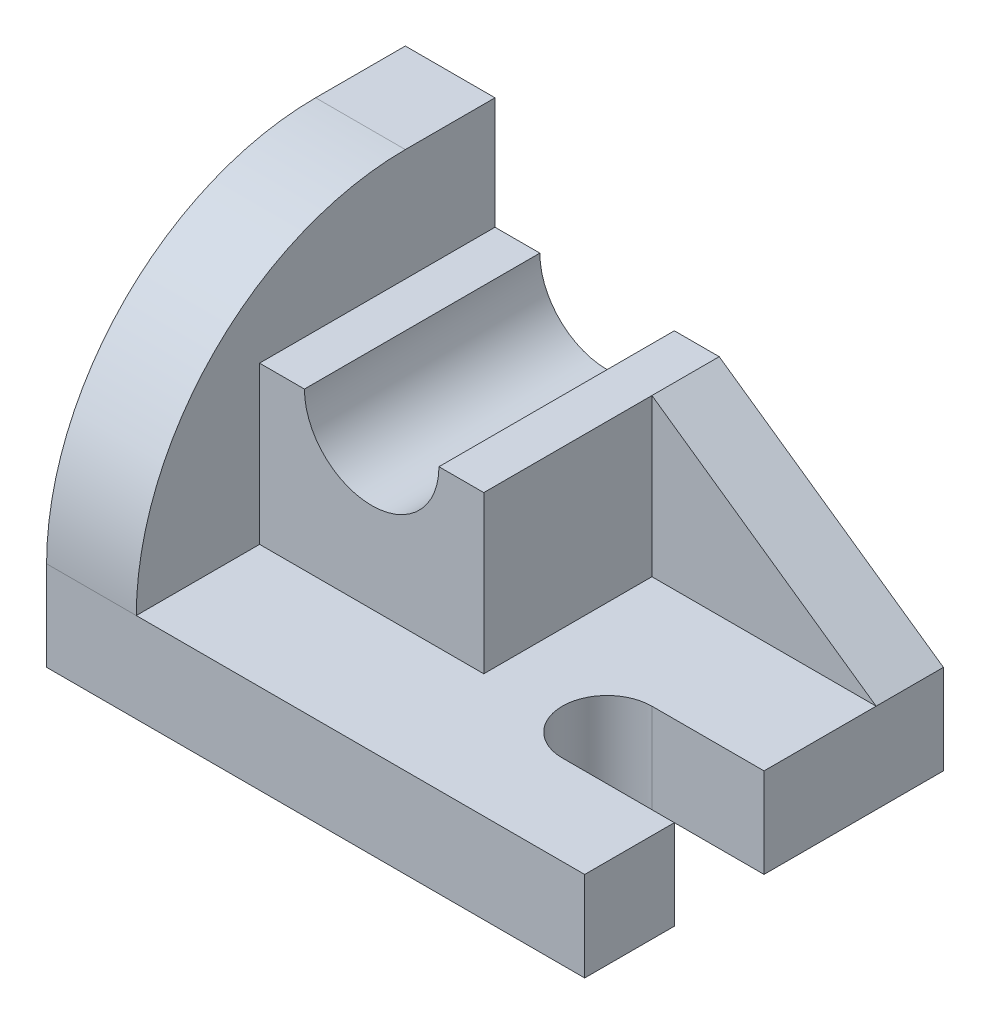
ISO-10303-21;
HEADER;
FILE_DESCRIPTION(('STEP AP214'),'2;1');
FILE_NAME('part.step','',(''),(''),'','','');
FILE_SCHEMA(('AUTOMOTIVE_DESIGN { 1 0 10303 214 1 1 1 1 }'));
ENDSEC;
DATA;
#1=APPLICATION_CONTEXT('core data for automotive mechanical design processes');
#2=APPLICATION_PROTOCOL_DEFINITION('international standard','automotive_design',2000,#1);
#3=PRODUCT_CONTEXT('',#1,'mechanical');
#4=PRODUCT('Part','Part','',(#3));
#5=PRODUCT_RELATED_PRODUCT_CATEGORY('part','',(#4));
#6=PRODUCT_DEFINITION_FORMATION('','',#4);
#7=PRODUCT_DEFINITION_CONTEXT('part definition',#1,'design');
#8=PRODUCT_DEFINITION('design','',#6,#7);
#9=PRODUCT_DEFINITION_SHAPE('','',#8);
#10=(LENGTH_UNIT() NAMED_UNIT(*) SI_UNIT(.MILLI.,.METRE.));
#11=(NAMED_UNIT(*) PLANE_ANGLE_UNIT() SI_UNIT($,.RADIAN.));
#12=(NAMED_UNIT(*) SI_UNIT($,.STERADIAN.) SOLID_ANGLE_UNIT());
#13=UNCERTAINTY_MEASURE_WITH_UNIT(LENGTH_MEASURE(1.E-05),#10,'distance_accuracy_value','');
#14=(GEOMETRIC_REPRESENTATION_CONTEXT(3) GLOBAL_UNCERTAINTY_ASSIGNED_CONTEXT((#13)) GLOBAL_UNIT_ASSIGNED_CONTEXT((#10,
#11,#12)) REPRESENTATION_CONTEXT('',''));
#15=CARTESIAN_POINT('',(0.,0.,0.));
#16=DIRECTION('',(0.,0.,1.));
#17=DIRECTION('',(1.,0.,0.));
#18=AXIS2_PLACEMENT_3D('',#15,#16,#17);
#19=CARTESIAN_POINT('',(0.,44.,0.));
#20=DIRECTION('',(0.,1.,0.));
#21=DIRECTION('',(0.,0.,1.));
#22=AXIS2_PLACEMENT_3D('',#19,#20,#21);
#23=PLANE('',#22);
#24=DIRECTION('',(0.,0.,1.));
#25=VECTOR('',#24,1.);
#26=CARTESIAN_POINT('',(24.,44.,-68.));
#27=LINE('',#26,#25);
#28=CARTESIAN_POINT('',(24.,44.,-64.));
#29=VERTEX_POINT('',#28);
#30=CARTESIAN_POINT('',(24.,44.,-22.));
#31=VERTEX_POINT('',#30);
#32=EDGE_CURVE('E11',#29,#31,#27,.T.);
#33=ORIENTED_EDGE('',*,*,#32,.F.);
#34=DIRECTION('',(-1.,0.,0.));
#35=VECTOR('',#34,1.);
#36=CARTESIAN_POINT('',(16.,44.,-64.));
#37=LINE('',#36,#35);
#38=CARTESIAN_POINT('',(16.,44.,-64.));
#39=VERTEX_POINT('',#38);
#40=EDGE_CURVE('E66',#29,#39,#37,.T.);
#41=ORIENTED_EDGE('',*,*,#40,.T.);
#42=DIRECTION('',(0.,0.,1.));
#43=VECTOR('',#42,1.);
#44=CARTESIAN_POINT('',(16.,44.,-64.));
#45=LINE('',#44,#43);
#46=CARTESIAN_POINT('',(16.,44.,-22.));
#47=VERTEX_POINT('',#46);
#48=EDGE_CURVE('E216',#39,#47,#45,.T.);
#49=ORIENTED_EDGE('',*,*,#48,.T.);
#50=DIRECTION('',(1.,0.,0.));
#51=VECTOR('',#50,1.);
#52=CARTESIAN_POINT('',(16.,44.,-22.));
#53=LINE('',#52,#51);
#54=EDGE_CURVE('E198',#47,#31,#53,.T.);
#55=ORIENTED_EDGE('',*,*,#54,.T.);
#56=EDGE_LOOP('',(#33,#41,#49,#55));
#57=FACE_BOUND('',#56,.T.);
#58=ADVANCED_FACE('F43',(#57),#23,.T.);
#59=CARTESIAN_POINT('',(0.,16.,0.));
#60=DIRECTION('',(0.,-1.,0.));
#61=DIRECTION('',(0.,0.,-1.));
#62=AXIS2_PLACEMENT_3D('',#59,#60,#61);
#63=PLANE('',#62);
#64=DIRECTION('',(0.,0.,-1.));
#65=VECTOR('',#64,1.);
#66=CARTESIAN_POINT('',(96.,16.,0.));
#67=LINE('',#66,#65);
#68=CARTESIAN_POINT('',(96.,16.,-32.));
#69=VERTEX_POINT('',#68);
#70=CARTESIAN_POINT('',(96.,16.,-52.));
#71=VERTEX_POINT('',#70);
#72=EDGE_CURVE('E294',#69,#71,#67,.T.);
#73=ORIENTED_EDGE('',*,*,#72,.T.);
#74=DIRECTION('',(-1.,0.,0.));
#75=VECTOR('',#74,1.);
#76=CARTESIAN_POINT('',(96.,16.,-52.));
#77=LINE('',#76,#75);
#78=CARTESIAN_POINT('',(56.,16.,-52.));
#79=VERTEX_POINT('',#78);
#80=EDGE_CURVE('E173',#71,#79,#77,.T.);
#81=ORIENTED_EDGE('',*,*,#80,.T.);
#82=DIRECTION('',(0.,0.,-1.));
#83=VECTOR('',#82,1.);
#84=CARTESIAN_POINT('',(56.,16.,-64.));
#85=LINE('',#84,#83);
#86=CARTESIAN_POINT('',(56.,16.,-22.));
#87=VERTEX_POINT('',#86);
#88=EDGE_CURVE('E190',#87,#79,#85,.T.);
#89=ORIENTED_EDGE('',*,*,#88,.F.);
#90=DIRECTION('',(1.,0.,0.));
#91=VECTOR('',#90,1.);
#92=CARTESIAN_POINT('',(16.,16.,-22.));
#93=LINE('',#92,#91);
#94=CARTESIAN_POINT('',(16.,16.,-22.));
#95=VERTEX_POINT('',#94);
#96=EDGE_CURVE('E210',#95,#87,#93,.T.);
#97=ORIENTED_EDGE('',*,*,#96,.F.);
#98=DIRECTION('',(0.,0.,-1.));
#99=VECTOR('',#98,1.);
#100=CARTESIAN_POINT('',(16.,16.,0.));
#101=LINE('',#100,#99);
#102=CARTESIAN_POINT('',(16.,16.,0.));
#103=VERTEX_POINT('',#102);
#104=EDGE_CURVE('E247',#103,#95,#101,.T.);
#105=ORIENTED_EDGE('',*,*,#104,.F.);
#106=DIRECTION('',(1.,0.,0.));
#107=VECTOR('',#106,1.);
#108=CARTESIAN_POINT('',(0.,16.,0.));
#109=LINE('',#108,#107);
#110=CARTESIAN_POINT('',(96.,16.,0.));
#111=VERTEX_POINT('',#110);
#112=EDGE_CURVE('E295',#103,#111,#109,.T.);
#113=ORIENTED_EDGE('',*,*,#112,.T.);
#114=CARTESIAN_POINT('',(96.,16.,-16.));
#115=VERTEX_POINT('',#114);
#116=EDGE_CURVE('E296',#111,#115,#67,.T.);
#117=ORIENTED_EDGE('',*,*,#116,.T.);
#118=DIRECTION('',(1.,0.,0.));
#119=VECTOR('',#118,1.);
#120=CARTESIAN_POINT('',(96.,16.,-16.));
#121=LINE('',#120,#119);
#122=CARTESIAN_POINT('',(76.,16.,-16.));
#123=VERTEX_POINT('',#122);
#124=EDGE_CURVE('E259',#123,#115,#121,.T.);
#125=ORIENTED_EDGE('',*,*,#124,.F.);
#126=CARTESIAN_POINT('',(76.,16.,-24.));
#127=DIRECTION('',(0.,1.,0.));
#128=DIRECTION('',(0.,0.,1.));
#129=AXIS2_PLACEMENT_3D('',#126,#127,#128);
#130=CIRCLE('',#129,8.);
#131=CARTESIAN_POINT('',(76.,16.,-32.));
#132=VERTEX_POINT('',#131);
#133=EDGE_CURVE('E271',#132,#123,#130,.T.);
#134=ORIENTED_EDGE('',*,*,#133,.F.);
#135=DIRECTION('',(-1.,0.,0.));
#136=VECTOR('',#135,1.);
#137=CARTESIAN_POINT('',(96.,16.,-32.));
#138=LINE('',#137,#136);
#139=EDGE_CURVE('E253',#69,#132,#138,.T.);
#140=ORIENTED_EDGE('',*,*,#139,.F.);
#141=EDGE_LOOP('',(#73,#81,#89,#97,#105,#113,#117,#125,#134,#140));
#142=FACE_BOUND('',#141,.T.);
#143=ADVANCED_FACE('F350',(#142),#63,.F.);
#144=CARTESIAN_POINT('',(16.,16.,-48.));
#145=DIRECTION('',(-1.,0.,0.));
#146=DIRECTION('',(0.,0.,1.));
#147=AXIS2_PLACEMENT_3D('',#144,#145,#146);
#148=PLANE('',#147);
#149=DIRECTION('',(0.,-1.,0.));
#150=VECTOR('',#149,1.);
#151=CARTESIAN_POINT('',(16.,44.,-22.));
#152=LINE('',#151,#150);
#153=EDGE_CURVE('E219',#47,#95,#152,.T.);
#154=ORIENTED_EDGE('',*,*,#153,.F.);
#155=ORIENTED_EDGE('',*,*,#48,.F.);
#156=DIRECTION('',(0.,-1.,0.));
#157=VECTOR('',#156,1.);
#158=CARTESIAN_POINT('',(16.,0.,-64.));
#159=LINE('',#158,#157);
#160=CARTESIAN_POINT('',(16.,64.,-64.));
#161=VERTEX_POINT('',#160);
#162=EDGE_CURVE('E223',#161,#39,#159,.T.);
#163=ORIENTED_EDGE('',*,*,#162,.F.);
#164=DIRECTION('',(0.,0.,-1.));
#165=VECTOR('',#164,1.);
#166=CARTESIAN_POINT('',(16.,64.,-64.));
#167=LINE('',#166,#165);
#168=CARTESIAN_POINT('',(16.,64.,-48.0000000000003));
#169=VERTEX_POINT('',#168);
#170=EDGE_CURVE('E232',#169,#161,#167,.T.);
#171=ORIENTED_EDGE('',*,*,#170,.F.);
#172=CARTESIAN_POINT('',(16.,16.,-48.));
#173=DIRECTION('',(-1.,0.,0.));
#174=DIRECTION('',(0.,0.,1.));
#175=AXIS2_PLACEMENT_3D('',#172,#173,#174);
#176=CIRCLE('',#175,48.);
#177=EDGE_CURVE('E227',#103,#169,#176,.T.);
#178=ORIENTED_EDGE('',*,*,#177,.F.);
#179=ORIENTED_EDGE('',*,*,#104,.T.);
#180=EDGE_LOOP('',(#154,#155,#163,#171,#178,#179));
#181=FACE_BOUND('',#180,.T.);
#182=ADVANCED_FACE('F343',(#181),#148,.F.);
#183=CARTESIAN_POINT('',(96.,16.,0.));
#184=DIRECTION('',(-1.,0.,0.));
#185=DIRECTION('',(0.,0.,1.));
#186=AXIS2_PLACEMENT_3D('',#183,#184,#185);
#187=PLANE('',#186);
#188=DIRECTION('',(0.,0.,-1.));
#189=VECTOR('',#188,1.);
#190=CARTESIAN_POINT('',(96.,0.,0.));
#191=LINE('',#190,#189);
#192=CARTESIAN_POINT('',(96.,0.,0.));
#193=VERTEX_POINT('',#192);
#194=CARTESIAN_POINT('',(96.,0.,-16.));
#195=VERTEX_POINT('',#194);
#196=EDGE_CURVE('E308',#193,#195,#191,.T.);
#197=ORIENTED_EDGE('',*,*,#196,.T.);
#198=DIRECTION('',(0.,1.,0.));
#199=VECTOR('',#198,1.);
#200=CARTESIAN_POINT('',(96.,0.,-16.));
#201=LINE('',#200,#199);
#202=EDGE_CURVE('E277',#195,#115,#201,.T.);
#203=ORIENTED_EDGE('',*,*,#202,.T.);
#204=ORIENTED_EDGE('',*,*,#116,.F.);
#205=DIRECTION('',(0.,-1.,0.));
#206=VECTOR('',#205,1.);
#207=CARTESIAN_POINT('',(96.,16.,0.));
#208=LINE('',#207,#206);
#209=EDGE_CURVE('E322',#111,#193,#208,.T.);
#210=ORIENTED_EDGE('',*,*,#209,.T.);
#211=EDGE_LOOP('',(#197,#203,#204,#210));
#212=FACE_BOUND('',#211,.T.);
#213=ADVANCED_FACE('F378',(#212),#187,.F.);
#214=CARTESIAN_POINT('',(0.,16.,0.));
#215=DIRECTION('',(1.,0.,0.));
#216=DIRECTION('',(0.,0.,-1.));
#217=AXIS2_PLACEMENT_3D('',#214,#215,#216);
#218=PLANE('',#217);
#219=DIRECTION('',(0.,0.,1.));
#220=VECTOR('',#219,1.);
#221=CARTESIAN_POINT('',(0.,0.,0.));
#222=LINE('',#221,#220);
#223=CARTESIAN_POINT('',(0.,0.,-64.));
#224=VERTEX_POINT('',#223);
#225=CARTESIAN_POINT('',(0.,0.,0.));
#226=VERTEX_POINT('',#225);
#227=EDGE_CURVE('E281',#224,#226,#222,.T.);
#228=ORIENTED_EDGE('',*,*,#227,.T.);
#229=DIRECTION('',(0.,-1.,0.));
#230=VECTOR('',#229,1.);
#231=CARTESIAN_POINT('',(0.,16.,0.));
#232=LINE('',#231,#230);
#233=CARTESIAN_POINT('',(0.,15.9999999999997,0.));
#234=VERTEX_POINT('',#233);
#235=EDGE_CURVE('E326',#234,#226,#232,.T.);
#236=ORIENTED_EDGE('',*,*,#235,.F.);
#237=CARTESIAN_POINT('',(0.,16.,-48.));
#238=DIRECTION('',(-1.,0.,0.));
#239=DIRECTION('',(0.,0.,1.));
#240=AXIS2_PLACEMENT_3D('',#237,#238,#239);
#241=CIRCLE('',#240,48.);
#242=CARTESIAN_POINT('',(0.,64.,-48.0000000000003));
#243=VERTEX_POINT('',#242);
#244=EDGE_CURVE('E222',#234,#243,#241,.T.);
#245=ORIENTED_EDGE('',*,*,#244,.T.);
#246=DIRECTION('',(0.,0.,-1.));
#247=VECTOR('',#246,1.);
#248=CARTESIAN_POINT('',(0.,64.,-64.));
#249=LINE('',#248,#247);
#250=CARTESIAN_POINT('',(0.,64.,-64.));
#251=VERTEX_POINT('',#250);
#252=EDGE_CURVE('E228',#243,#251,#249,.T.);
#253=ORIENTED_EDGE('',*,*,#252,.T.);
#254=DIRECTION('',(0.,-1.,0.));
#255=VECTOR('',#254,1.);
#256=CARTESIAN_POINT('',(0.,16.,-64.));
#257=LINE('',#256,#255);
#258=EDGE_CURVE('E300',#251,#224,#257,.T.);
#259=ORIENTED_EDGE('',*,*,#258,.T.);
#260=EDGE_LOOP('',(#228,#236,#245,#253,#259));
#261=FACE_BOUND('',#260,.T.);
#262=ADVANCED_FACE('F45',(#261),#218,.F.);
#263=CARTESIAN_POINT('',(0.,16.,0.));
#264=DIRECTION('',(0.,0.,-1.));
#265=DIRECTION('',(-1.,0.,0.));
#266=AXIS2_PLACEMENT_3D('',#263,#264,#265);
#267=PLANE('',#266);
#268=DIRECTION('',(1.,0.,0.));
#269=VECTOR('',#268,1.);
#270=CARTESIAN_POINT('',(0.,0.,0.));
#271=LINE('',#270,#269);
#272=EDGE_CURVE('E304',#226,#193,#271,.T.);
#273=ORIENTED_EDGE('',*,*,#272,.T.);
#274=ORIENTED_EDGE('',*,*,#209,.F.);
#275=ORIENTED_EDGE('',*,*,#112,.F.);
#276=EDGE_CURVE('E290',#234,#103,#109,.T.);
#277=ORIENTED_EDGE('',*,*,#276,.F.);
#278=ORIENTED_EDGE('',*,*,#235,.T.);
#279=EDGE_LOOP('',(#273,#274,#275,#277,#278));
#280=FACE_BOUND('',#279,.T.);
#281=ADVANCED_FACE('F375',(#280),#267,.F.);
#282=ORIENTED_EDGE('',*,*,#72,.F.);
#283=DIRECTION('',(0.,1.,0.));
#284=VECTOR('',#283,1.);
#285=CARTESIAN_POINT('',(96.,0.,-32.));
#286=LINE('',#285,#284);
#287=CARTESIAN_POINT('',(96.,0.,-32.));
#288=VERTEX_POINT('',#287);
#289=EDGE_CURVE('E267',#288,#69,#286,.T.);
#290=ORIENTED_EDGE('',*,*,#289,.F.);
#291=CARTESIAN_POINT('',(96.,0.,-64.));
#292=VERTEX_POINT('',#291);
#293=EDGE_CURVE('E307',#288,#292,#191,.T.);
#294=ORIENTED_EDGE('',*,*,#293,.T.);
#295=DIRECTION('',(0.,-1.,0.));
#296=VECTOR('',#295,1.);
#297=CARTESIAN_POINT('',(96.,16.,-64.));
#298=LINE('',#297,#296);
#299=CARTESIAN_POINT('',(96.,16.,-64.));
#300=VERTEX_POINT('',#299);
#301=EDGE_CURVE('E318',#300,#292,#298,.T.);
#302=ORIENTED_EDGE('',*,*,#301,.F.);
#303=DIRECTION('',(0.,0.,-1.));
#304=VECTOR('',#303,1.);
#305=CARTESIAN_POINT('',(96.,16.,-52.));
#306=LINE('',#305,#304);
#307=EDGE_CURVE('E172',#71,#300,#306,.T.);
#308=ORIENTED_EDGE('',*,*,#307,.F.);
#309=EDGE_LOOP('',(#282,#290,#294,#302,#308));
#310=FACE_BOUND('',#309,.T.);
#311=ADVANCED_FACE('F363',(#310),#187,.F.);
#312=CARTESIAN_POINT('',(0.,16.,-64.));
#313=DIRECTION('',(0.,0.,1.));
#314=DIRECTION('',(1.,0.,0.));
#315=AXIS2_PLACEMENT_3D('',#312,#313,#314);
#316=PLANE('',#315);
#317=ORIENTED_EDGE('',*,*,#40,.F.);
#318=CARTESIAN_POINT('',(36.,44.,-64.));
#319=DIRECTION('',(0.,0.,1.));
#320=DIRECTION('',(1.,0.,0.));
#321=AXIS2_PLACEMENT_3D('',#318,#319,#320);
#322=CIRCLE('',#321,12.);
#323=CARTESIAN_POINT('',(48.,44.,-64.));
#324=VERTEX_POINT('',#323);
#325=EDGE_CURVE('E213',#29,#324,#322,.T.);
#326=ORIENTED_EDGE('',*,*,#325,.T.);
#327=CARTESIAN_POINT('',(56.,44.,-64.));
#328=VERTEX_POINT('',#327);
#329=EDGE_CURVE('E202',#328,#324,#37,.T.);
#330=ORIENTED_EDGE('',*,*,#329,.F.);
#331=DIRECTION('',(0.819231920519041,-0.573462344363328,0.));
#332=VECTOR('',#331,1.);
#333=CARTESIAN_POINT('',(56.,44.,-64.));
#334=LINE('',#333,#332);
#335=EDGE_CURVE('E166',#328,#300,#334,.T.);
#336=ORIENTED_EDGE('',*,*,#335,.T.);
#337=ORIENTED_EDGE('',*,*,#301,.T.);
#338=DIRECTION('',(-1.,0.,0.));
#339=VECTOR('',#338,1.);
#340=CARTESIAN_POINT('',(0.,0.,-64.));
#341=LINE('',#340,#339);
#342=EDGE_CURVE('E312',#292,#224,#341,.T.);
#343=ORIENTED_EDGE('',*,*,#342,.T.);
#344=ORIENTED_EDGE('',*,*,#258,.F.);
#345=DIRECTION('',(-1.,0.,0.));
#346=VECTOR('',#345,1.);
#347=CARTESIAN_POINT('',(16.,64.,-64.));
#348=LINE('',#347,#346);
#349=EDGE_CURVE('E243',#161,#251,#348,.T.);
#350=ORIENTED_EDGE('',*,*,#349,.F.);
#351=ORIENTED_EDGE('',*,*,#162,.T.);
#352=EDGE_LOOP('',(#317,#326,#330,#336,#337,#343,#344,#350,#351));
#353=FACE_BOUND('',#352,.T.);
#354=ADVANCED_FACE('F333',(#353),#316,.F.);
#355=CARTESIAN_POINT('',(0.,0.,0.));
#356=DIRECTION('',(0.,-1.,0.));
#357=DIRECTION('',(0.,0.,-1.));
#358=AXIS2_PLACEMENT_3D('',#355,#356,#357);
#359=PLANE('',#358);
#360=ORIENTED_EDGE('',*,*,#227,.F.);
#361=ORIENTED_EDGE('',*,*,#342,.F.);
#362=ORIENTED_EDGE('',*,*,#293,.F.);
#363=DIRECTION('',(-1.,0.,0.));
#364=VECTOR('',#363,1.);
#365=CARTESIAN_POINT('',(96.,0.,-32.));
#366=LINE('',#365,#364);
#367=CARTESIAN_POINT('',(76.,0.,-32.));
#368=VERTEX_POINT('',#367);
#369=EDGE_CURVE('E254',#288,#368,#366,.T.);
#370=ORIENTED_EDGE('',*,*,#369,.T.);
#371=CARTESIAN_POINT('',(76.,0.,-24.));
#372=DIRECTION('',(0.,1.,0.));
#373=DIRECTION('',(0.,0.,1.));
#374=AXIS2_PLACEMENT_3D('',#371,#372,#373);
#375=CIRCLE('',#374,8.);
#376=CARTESIAN_POINT('',(76.,0.,-16.));
#377=VERTEX_POINT('',#376);
#378=EDGE_CURVE('E258',#368,#377,#375,.T.);
#379=ORIENTED_EDGE('',*,*,#378,.T.);
#380=DIRECTION('',(1.,0.,0.));
#381=VECTOR('',#380,1.);
#382=CARTESIAN_POINT('',(96.,0.,-16.));
#383=LINE('',#382,#381);
#384=EDGE_CURVE('E263',#377,#195,#383,.T.);
#385=ORIENTED_EDGE('',*,*,#384,.T.);
#386=ORIENTED_EDGE('',*,*,#196,.F.);
#387=ORIENTED_EDGE('',*,*,#272,.F.);
#388=EDGE_LOOP('',(#360,#361,#362,#370,#379,#385,#386,#387));
#389=FACE_BOUND('',#388,.T.);
#390=ADVANCED_FACE('F383',(#389),#359,.T.);
#391=CARTESIAN_POINT('',(96.,0.,-16.));
#392=DIRECTION('',(0.,0.,1.));
#393=DIRECTION('',(1.,0.,0.));
#394=AXIS2_PLACEMENT_3D('',#391,#392,#393);
#395=PLANE('',#394);
#396=ORIENTED_EDGE('',*,*,#124,.T.);
#397=ORIENTED_EDGE('',*,*,#202,.F.);
#398=ORIENTED_EDGE('',*,*,#384,.F.);
#399=DIRECTION('',(0.,1.,0.));
#400=VECTOR('',#399,1.);
#401=CARTESIAN_POINT('',(76.,0.,-16.));
#402=LINE('',#401,#400);
#403=EDGE_CURVE('E282',#377,#123,#402,.T.);
#404=ORIENTED_EDGE('',*,*,#403,.T.);
#405=EDGE_LOOP('',(#396,#397,#398,#404));
#406=FACE_BOUND('',#405,.T.);
#407=ADVANCED_FACE('F381',(#406),#395,.F.);
#408=CARTESIAN_POINT('',(76.,0.,-24.));
#409=DIRECTION('',(0.,1.,0.));
#410=DIRECTION('',(0.,0.,1.));
#411=AXIS2_PLACEMENT_3D('',#408,#409,#410);
#412=CYLINDRICAL_SURFACE('',#411,8.);
#413=ORIENTED_EDGE('',*,*,#133,.T.);
#414=ORIENTED_EDGE('',*,*,#403,.F.);
#415=ORIENTED_EDGE('',*,*,#378,.F.);
#416=DIRECTION('',(0.,1.,0.));
#417=VECTOR('',#416,1.);
#418=CARTESIAN_POINT('',(76.,0.,-32.));
#419=LINE('',#418,#417);
#420=EDGE_CURVE('E285',#368,#132,#419,.T.);
#421=ORIENTED_EDGE('',*,*,#420,.T.);
#422=EDGE_LOOP('',(#413,#414,#415,#421));
#423=FACE_BOUND('',#422,.T.);
#424=ADVANCED_FACE('F386',(#423),#412,.F.);
#425=CARTESIAN_POINT('',(96.,0.,-32.));
#426=DIRECTION('',(0.,0.,-1.));
#427=DIRECTION('',(-1.,0.,0.));
#428=AXIS2_PLACEMENT_3D('',#425,#426,#427);
#429=PLANE('',#428);
#430=ORIENTED_EDGE('',*,*,#139,.T.);
#431=ORIENTED_EDGE('',*,*,#420,.F.);
#432=ORIENTED_EDGE('',*,*,#369,.F.);
#433=ORIENTED_EDGE('',*,*,#289,.T.);
#434=EDGE_LOOP('',(#430,#431,#432,#433));
#435=FACE_BOUND('',#434,.T.);
#436=ADVANCED_FACE('F388',(#435),#429,.F.);
#437=CARTESIAN_POINT('',(16.,64.,-64.));
#438=DIRECTION('',(0.,1.,0.));
#439=DIRECTION('',(0.,0.,1.));
#440=AXIS2_PLACEMENT_3D('',#437,#438,#439);
#441=PLANE('',#440);
#442=ORIENTED_EDGE('',*,*,#252,.F.);
#443=DIRECTION('',(-1.,0.,0.));
#444=VECTOR('',#443,1.);
#445=CARTESIAN_POINT('',(16.,64.,-48.0000000000003));
#446=LINE('',#445,#444);
#447=EDGE_CURVE('E236',#169,#243,#446,.T.);
#448=ORIENTED_EDGE('',*,*,#447,.F.);
#449=ORIENTED_EDGE('',*,*,#170,.T.);
#450=ORIENTED_EDGE('',*,*,#349,.T.);
#451=EDGE_LOOP('',(#442,#448,#449,#450));
#452=FACE_BOUND('',#451,.T.);
#453=ADVANCED_FACE('F391',(#452),#441,.T.);
#454=CARTESIAN_POINT('',(16.,16.,-48.));
#455=DIRECTION('',(-1.,0.,0.));
#456=DIRECTION('',(0.,0.,1.));
#457=AXIS2_PLACEMENT_3D('',#454,#455,#456);
#458=CYLINDRICAL_SURFACE('',#457,48.);
#459=ORIENTED_EDGE('',*,*,#244,.F.);
#460=ORIENTED_EDGE('',*,*,#276,.T.);
#461=ORIENTED_EDGE('',*,*,#177,.T.);
#462=ORIENTED_EDGE('',*,*,#447,.T.);
#463=EDGE_LOOP('',(#459,#460,#461,#462));
#464=FACE_BOUND('',#463,.T.);
#465=ADVANCED_FACE('F397',(#464),#458,.T.);
#466=CARTESIAN_POINT('',(16.,44.,-22.));
#467=DIRECTION('',(0.,0.,-1.));
#468=DIRECTION('',(-1.,0.,0.));
#469=AXIS2_PLACEMENT_3D('',#466,#467,#468);
#470=PLANE('',#469);
#471=CARTESIAN_POINT('',(48.,44.,-22.));
#472=VERTEX_POINT('',#471);
#473=CARTESIAN_POINT('',(56.,44.,-22.));
#474=VERTEX_POINT('',#473);
#475=EDGE_CURVE('E195',#472,#474,#53,.T.);
#476=ORIENTED_EDGE('',*,*,#475,.F.);
#477=CARTESIAN_POINT('',(36.,44.,-22.));
#478=DIRECTION('',(0.,0.,1.));
#479=DIRECTION('',(1.,0.,0.));
#480=AXIS2_PLACEMENT_3D('',#477,#478,#479);
#481=CIRCLE('',#480,12.);
#482=EDGE_CURVE('E58',#31,#472,#481,.T.);
#483=ORIENTED_EDGE('',*,*,#482,.F.);
#484=ORIENTED_EDGE('',*,*,#54,.F.);
#485=ORIENTED_EDGE('',*,*,#153,.T.);
#486=ORIENTED_EDGE('',*,*,#96,.T.);
#487=DIRECTION('',(0.,-1.,0.));
#488=VECTOR('',#487,1.);
#489=CARTESIAN_POINT('',(56.,44.,-22.));
#490=LINE('',#489,#488);
#491=EDGE_CURVE('E209',#474,#87,#490,.T.);
#492=ORIENTED_EDGE('',*,*,#491,.F.);
#493=EDGE_LOOP('',(#476,#483,#484,#485,#486,#492));
#494=FACE_BOUND('',#493,.T.);
#495=ADVANCED_FACE('F347',(#494),#470,.F.);
#496=CARTESIAN_POINT('',(56.,44.,-64.));
#497=DIRECTION('',(-1.,0.,0.));
#498=DIRECTION('',(0.,0.,1.));
#499=AXIS2_PLACEMENT_3D('',#496,#497,#498);
#500=PLANE('',#499);
#501=ORIENTED_EDGE('',*,*,#88,.T.);
#502=DIRECTION('',(0.,1.,0.));
#503=VECTOR('',#502,1.);
#504=CARTESIAN_POINT('',(56.,16.,-52.));
#505=LINE('',#504,#503);
#506=CARTESIAN_POINT('',(56.,44.,-52.));
#507=VERTEX_POINT('',#506);
#508=EDGE_CURVE('E178',#79,#507,#505,.T.);
#509=ORIENTED_EDGE('',*,*,#508,.T.);
#510=DIRECTION('',(0.,0.,-1.));
#511=VECTOR('',#510,1.);
#512=CARTESIAN_POINT('',(56.,44.,-64.));
#513=LINE('',#512,#511);
#514=EDGE_CURVE('E188',#474,#507,#513,.T.);
#515=ORIENTED_EDGE('',*,*,#514,.F.);
#516=ORIENTED_EDGE('',*,*,#491,.T.);
#517=EDGE_LOOP('',(#501,#509,#515,#516));
#518=FACE_BOUND('',#517,.T.);
#519=ADVANCED_FACE('F186',(#518),#500,.F.);
#520=DIRECTION('',(0.,0.,1.));
#521=VECTOR('',#520,1.);
#522=CARTESIAN_POINT('',(48.,44.,-68.));
#523=LINE('',#522,#521);
#524=EDGE_CURVE('E52',#472,#324,#523,.F.);
#525=ORIENTED_EDGE('',*,*,#524,.F.);
#526=ORIENTED_EDGE('',*,*,#475,.T.);
#527=ORIENTED_EDGE('',*,*,#514,.T.);
#528=DIRECTION('',(0.,0.,-1.));
#529=VECTOR('',#528,1.);
#530=CARTESIAN_POINT('',(56.,44.,-52.));
#531=LINE('',#530,#529);
#532=EDGE_CURVE('E160',#507,#328,#531,.T.);
#533=ORIENTED_EDGE('',*,*,#532,.T.);
#534=ORIENTED_EDGE('',*,*,#329,.T.);
#535=EDGE_LOOP('',(#525,#526,#527,#533,#534));
#536=FACE_BOUND('',#535,.T.);
#537=ADVANCED_FACE('F193',(#536),#23,.T.);
#538=CARTESIAN_POINT('',(36.,44.,-68.));
#539=DIRECTION('',(0.,0.,1.));
#540=DIRECTION('',(1.,0.,0.));
#541=AXIS2_PLACEMENT_3D('',#538,#539,#540);
#542=CYLINDRICAL_SURFACE('',#541,12.);
#543=ORIENTED_EDGE('',*,*,#32,.T.);
#544=ORIENTED_EDGE('',*,*,#482,.T.);
#545=ORIENTED_EDGE('',*,*,#524,.T.);
#546=ORIENTED_EDGE('',*,*,#325,.F.);
#547=EDGE_LOOP('',(#543,#544,#545,#546));
#548=FACE_BOUND('',#547,.T.);
#549=ADVANCED_FACE('F331',(#548),#542,.F.);
#550=CARTESIAN_POINT('',(56.,44.,-52.));
#551=DIRECTION('',(0.573462344363328,0.81923192051904,0.));
#552=DIRECTION('',(-0.819231920519041,0.573462344363328,0.));
#553=AXIS2_PLACEMENT_3D('',#550,#551,#552);
#554=PLANE('',#553);
#555=ORIENTED_EDGE('',*,*,#335,.F.);
#556=ORIENTED_EDGE('',*,*,#532,.F.);
#557=DIRECTION('',(0.819231920519041,-0.573462344363328,0.));
#558=VECTOR('',#557,1.);
#559=CARTESIAN_POINT('',(56.,44.,-52.));
#560=LINE('',#559,#558);
#561=EDGE_CURVE('E163',#507,#71,#560,.T.);
#562=ORIENTED_EDGE('',*,*,#561,.T.);
#563=ORIENTED_EDGE('',*,*,#307,.T.);
#564=EDGE_LOOP('',(#555,#556,#562,#563));
#565=FACE_BOUND('',#564,.T.);
#566=ADVANCED_FACE('F162',(#565),#554,.T.);
#567=CARTESIAN_POINT('',(0.,0.,-52.));
#568=DIRECTION('',(0.,0.,1.));
#569=DIRECTION('',(1.,0.,0.));
#570=AXIS2_PLACEMENT_3D('',#567,#568,#569);
#571=PLANE('',#570);
#572=ORIENTED_EDGE('',*,*,#508,.F.);
#573=ORIENTED_EDGE('',*,*,#80,.F.);
#574=ORIENTED_EDGE('',*,*,#561,.F.);
#575=EDGE_LOOP('',(#572,#573,#574));
#576=FACE_BOUND('',#575,.T.);
#577=ADVANCED_FACE('F177',(#576),#571,.T.);
#578=CLOSED_SHELL('',(#58,#143,#182,#213,#262,#281,#311,#354,#390,#407,#424,#436,#453,#465,#495,
#519,#537,#549,#566,#577));
#579=MANIFOLD_SOLID_BREP('B2',#578);
#580=ADVANCED_BREP_SHAPE_REPRESENTATION('',(#18,#579),#14);
#581=SHAPE_DEFINITION_REPRESENTATION(#9,#580);
ENDSEC;
END-ISO-10303-21;
